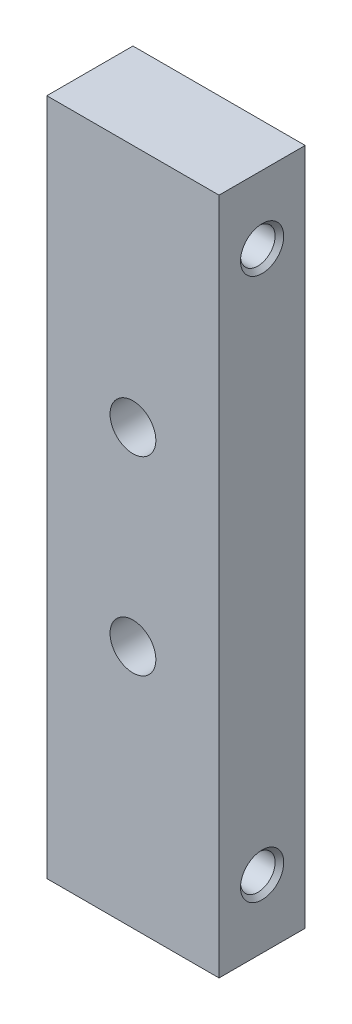
ISO-10303-21;
HEADER;
FILE_DESCRIPTION(('STEP AP214'),'2;1');
FILE_NAME('part.step','',(''),(''),'','','');
FILE_SCHEMA(('AUTOMOTIVE_DESIGN { 1 0 10303 214 1 1 1 1 }'));
ENDSEC;
DATA;
#1=APPLICATION_CONTEXT('core data for automotive mechanical design processes');
#2=APPLICATION_PROTOCOL_DEFINITION('international standard','automotive_design',2000,#1);
#3=PRODUCT_CONTEXT('',#1,'mechanical');
#4=PRODUCT('Part','Part','',(#3));
#5=PRODUCT_RELATED_PRODUCT_CATEGORY('part','',(#4));
#6=PRODUCT_DEFINITION_FORMATION('','',#4);
#7=PRODUCT_DEFINITION_CONTEXT('part definition',#1,'design');
#8=PRODUCT_DEFINITION('design','',#6,#7);
#9=PRODUCT_DEFINITION_SHAPE('','',#8);
#10=(LENGTH_UNIT() NAMED_UNIT(*) SI_UNIT(.MILLI.,.METRE.));
#11=(NAMED_UNIT(*) PLANE_ANGLE_UNIT() SI_UNIT($,.RADIAN.));
#12=(NAMED_UNIT(*) SI_UNIT($,.STERADIAN.) SOLID_ANGLE_UNIT());
#13=UNCERTAINTY_MEASURE_WITH_UNIT(LENGTH_MEASURE(1.E-05),#10,'distance_accuracy_value','');
#14=(GEOMETRIC_REPRESENTATION_CONTEXT(3) GLOBAL_UNCERTAINTY_ASSIGNED_CONTEXT((#13)) GLOBAL_UNIT_ASSIGNED_CONTEXT((#10,
#11,#12)) REPRESENTATION_CONTEXT('',''));
#15=CARTESIAN_POINT('',(0.,0.,0.));
#16=DIRECTION('',(0.,0.,1.));
#17=DIRECTION('',(1.,0.,0.));
#18=AXIS2_PLACEMENT_3D('',#15,#16,#17);
#19=CARTESIAN_POINT('',(-12.7,50.,6.35));
#20=DIRECTION('',(1.,0.,0.));
#21=DIRECTION('',(0.,1.,0.));
#22=AXIS2_PLACEMENT_3D('',#19,#20,#21);
#23=PLANE('',#22);
#24=CARTESIAN_POINT('',(-12.7,40.,0.));
#25=DIRECTION('',(-1.,0.,0.));
#26=DIRECTION('',(0.,0.,1.));
#27=AXIS2_PLACEMENT_3D('',#24,#25,#26);
#28=CIRCLE('',#27,3.1877);
#29=CARTESIAN_POINT('',(-12.7,40.,3.1877));
#30=VERTEX_POINT('',#29);
#31=EDGE_CURVE('E141',#30,#30,#28,.T.);
#32=ORIENTED_EDGE('',*,*,#31,.F.);
#33=EDGE_LOOP('',(#32));
#34=FACE_BOUND('',#33,.T.);
#35=CARTESIAN_POINT('',(-12.7,-40.,0.));
#36=DIRECTION('',(-1.,0.,0.));
#37=DIRECTION('',(0.,0.,1.));
#38=AXIS2_PLACEMENT_3D('',#35,#36,#37);
#39=CIRCLE('',#38,3.1877);
#40=CARTESIAN_POINT('',(-12.7,-40.,3.1877));
#41=VERTEX_POINT('',#40);
#42=EDGE_CURVE('E129',#41,#41,#39,.T.);
#43=ORIENTED_EDGE('',*,*,#42,.F.);
#44=EDGE_LOOP('',(#43));
#45=FACE_BOUND('',#44,.T.);
#46=DIRECTION('',(0.,-1.,0.));
#47=VECTOR('',#46,1.);
#48=CARTESIAN_POINT('',(-12.7,50.,-6.35));
#49=LINE('',#48,#47);
#50=CARTESIAN_POINT('',(-12.7,50.,-6.35));
#51=VERTEX_POINT('',#50);
#52=CARTESIAN_POINT('',(-12.7,-50.,-6.35));
#53=VERTEX_POINT('',#52);
#54=EDGE_CURVE('E98',#51,#53,#49,.T.);
#55=ORIENTED_EDGE('',*,*,#54,.T.);
#56=DIRECTION('',(0.,0.,-1.));
#57=VECTOR('',#56,1.);
#58=CARTESIAN_POINT('',(-12.7,-50.,6.35));
#59=LINE('',#58,#57);
#60=CARTESIAN_POINT('',(-12.7,-50.,6.35));
#61=VERTEX_POINT('',#60);
#62=EDGE_CURVE('E11',#61,#53,#59,.T.);
#63=ORIENTED_EDGE('',*,*,#62,.F.);
#64=DIRECTION('',(0.,-1.,0.));
#65=VECTOR('',#64,1.);
#66=CARTESIAN_POINT('',(-12.7,50.,6.35));
#67=LINE('',#66,#65);
#68=CARTESIAN_POINT('',(-12.7,50.,6.35));
#69=VERTEX_POINT('',#68);
#70=EDGE_CURVE('E86',#69,#61,#67,.T.);
#71=ORIENTED_EDGE('',*,*,#70,.F.);
#72=DIRECTION('',(0.,0.,-1.));
#73=VECTOR('',#72,1.);
#74=CARTESIAN_POINT('',(-12.7,50.,6.35));
#75=LINE('',#74,#73);
#76=EDGE_CURVE('E94',#69,#51,#75,.T.);
#77=ORIENTED_EDGE('',*,*,#76,.T.);
#78=EDGE_LOOP('',(#55,#63,#71,#77));
#79=FACE_BOUND('',#78,.T.);
#80=ADVANCED_FACE('F35',(#34,#45,#79),#23,.F.);
#81=CARTESIAN_POINT('',(-12.7,-50.,6.35));
#82=DIRECTION('',(0.,1.,0.));
#83=DIRECTION('',(0.,0.,1.));
#84=AXIS2_PLACEMENT_3D('',#81,#82,#83);
#85=PLANE('',#84);
#86=DIRECTION('',(1.,0.,0.));
#87=VECTOR('',#86,1.);
#88=CARTESIAN_POINT('',(-12.7,-50.,-6.35));
#89=LINE('',#88,#87);
#90=CARTESIAN_POINT('',(12.7,-50.,-6.35));
#91=VERTEX_POINT('',#90);
#92=EDGE_CURVE('E90',#53,#91,#89,.T.);
#93=ORIENTED_EDGE('',*,*,#92,.T.);
#94=DIRECTION('',(0.,0.,-1.));
#95=VECTOR('',#94,1.);
#96=CARTESIAN_POINT('',(12.7,-50.,6.35));
#97=LINE('',#96,#95);
#98=CARTESIAN_POINT('',(12.7,-50.,6.35));
#99=VERTEX_POINT('',#98);
#100=EDGE_CURVE('E43',#99,#91,#97,.T.);
#101=ORIENTED_EDGE('',*,*,#100,.F.);
#102=DIRECTION('',(1.,0.,0.));
#103=VECTOR('',#102,1.);
#104=CARTESIAN_POINT('',(-12.7,-50.,6.35));
#105=LINE('',#104,#103);
#106=EDGE_CURVE('E81',#61,#99,#105,.T.);
#107=ORIENTED_EDGE('',*,*,#106,.F.);
#108=ORIENTED_EDGE('',*,*,#62,.T.);
#109=EDGE_LOOP('',(#93,#101,#107,#108));
#110=FACE_BOUND('',#109,.T.);
#111=ADVANCED_FACE('F89',(#110),#85,.F.);
#112=CARTESIAN_POINT('',(12.7,50.,6.35));
#113=DIRECTION('',(-1.,0.,0.));
#114=DIRECTION('',(0.,0.,1.));
#115=AXIS2_PLACEMENT_3D('',#112,#113,#114);
#116=PLANE('',#115);
#117=CARTESIAN_POINT('',(12.7,40.,0.));
#118=DIRECTION('',(-1.,0.,0.));
#119=DIRECTION('',(0.,0.,1.));
#120=AXIS2_PLACEMENT_3D('',#117,#118,#119);
#121=CIRCLE('',#120,3.18769999999999);
#122=CARTESIAN_POINT('',(12.7,40.,3.18769999999999));
#123=VERTEX_POINT('',#122);
#124=EDGE_CURVE('E144',#123,#123,#121,.T.);
#125=ORIENTED_EDGE('',*,*,#124,.T.);
#126=EDGE_LOOP('',(#125));
#127=FACE_BOUND('',#126,.T.);
#128=CARTESIAN_POINT('',(12.7,-40.,0.));
#129=DIRECTION('',(-1.,0.,0.));
#130=DIRECTION('',(0.,0.,1.));
#131=AXIS2_PLACEMENT_3D('',#128,#129,#130);
#132=CIRCLE('',#131,3.18769999999999);
#133=CARTESIAN_POINT('',(12.7,-40.,3.18769999999999));
#134=VERTEX_POINT('',#133);
#135=EDGE_CURVE('E132',#134,#134,#132,.T.);
#136=ORIENTED_EDGE('',*,*,#135,.T.);
#137=EDGE_LOOP('',(#136));
#138=FACE_BOUND('',#137,.T.);
#139=DIRECTION('',(0.,1.,0.));
#140=VECTOR('',#139,1.);
#141=CARTESIAN_POINT('',(12.7,50.,-6.35));
#142=LINE('',#141,#140);
#143=CARTESIAN_POINT('',(12.7,50.,-6.35));
#144=VERTEX_POINT('',#143);
#145=EDGE_CURVE('E68',#91,#144,#142,.T.);
#146=ORIENTED_EDGE('',*,*,#145,.T.);
#147=DIRECTION('',(0.,0.,-1.));
#148=VECTOR('',#147,1.);
#149=CARTESIAN_POINT('',(12.7,50.,6.35));
#150=LINE('',#149,#148);
#151=CARTESIAN_POINT('',(12.7,50.,6.35));
#152=VERTEX_POINT('',#151);
#153=EDGE_CURVE('E91',#152,#144,#150,.T.);
#154=ORIENTED_EDGE('',*,*,#153,.F.);
#155=DIRECTION('',(0.,1.,0.));
#156=VECTOR('',#155,1.);
#157=CARTESIAN_POINT('',(12.7,50.,6.35));
#158=LINE('',#157,#156);
#159=EDGE_CURVE('E84',#99,#152,#158,.T.);
#160=ORIENTED_EDGE('',*,*,#159,.F.);
#161=ORIENTED_EDGE('',*,*,#100,.T.);
#162=EDGE_LOOP('',(#146,#154,#160,#161));
#163=FACE_BOUND('',#162,.T.);
#164=ADVANCED_FACE('F92',(#127,#138,#163),#116,.F.);
#165=CARTESIAN_POINT('',(-12.7,50.,6.35));
#166=DIRECTION('',(0.,-1.,0.));
#167=DIRECTION('',(0.,0.,-1.));
#168=AXIS2_PLACEMENT_3D('',#165,#166,#167);
#169=PLANE('',#168);
#170=DIRECTION('',(-1.,0.,0.));
#171=VECTOR('',#170,1.);
#172=CARTESIAN_POINT('',(-12.7,50.,-6.35));
#173=LINE('',#172,#171);
#174=EDGE_CURVE('E74',#144,#51,#173,.T.);
#175=ORIENTED_EDGE('',*,*,#174,.T.);
#176=ORIENTED_EDGE('',*,*,#76,.F.);
#177=DIRECTION('',(-1.,0.,0.));
#178=VECTOR('',#177,1.);
#179=CARTESIAN_POINT('',(-12.7,50.,6.35));
#180=LINE('',#179,#178);
#181=EDGE_CURVE('E51',#152,#69,#180,.T.);
#182=ORIENTED_EDGE('',*,*,#181,.F.);
#183=ORIENTED_EDGE('',*,*,#153,.T.);
#184=EDGE_LOOP('',(#175,#176,#182,#183));
#185=FACE_BOUND('',#184,.T.);
#186=ADVANCED_FACE('F106',(#185),#169,.F.);
#187=CARTESIAN_POINT('',(0.,0.,6.35));
#188=DIRECTION('',(0.,0.,1.));
#189=DIRECTION('',(1.,0.,0.));
#190=AXIS2_PLACEMENT_3D('',#187,#188,#189);
#191=PLANE('',#190);
#192=CARTESIAN_POINT('',(0.,-14.,6.35));
#193=DIRECTION('',(0.,0.,1.));
#194=DIRECTION('',(1.,0.,0.));
#195=AXIS2_PLACEMENT_3D('',#192,#193,#194);
#196=CIRCLE('',#195,3.3782);
#197=CARTESIAN_POINT('',(3.3782,-14.,6.35));
#198=VERTEX_POINT('',#197);
#199=EDGE_CURVE('E120',#198,#198,#196,.T.);
#200=ORIENTED_EDGE('',*,*,#199,.F.);
#201=EDGE_LOOP('',(#200));
#202=FACE_BOUND('',#201,.T.);
#203=CARTESIAN_POINT('',(0.,14.,6.35));
#204=DIRECTION('',(0.,0.,1.));
#205=DIRECTION('',(1.,0.,0.));
#206=AXIS2_PLACEMENT_3D('',#203,#204,#205);
#207=CIRCLE('',#206,3.3782);
#208=CARTESIAN_POINT('',(3.3782,14.,6.35));
#209=VERTEX_POINT('',#208);
#210=EDGE_CURVE('E114',#209,#209,#207,.T.);
#211=ORIENTED_EDGE('',*,*,#210,.F.);
#212=EDGE_LOOP('',(#211));
#213=FACE_BOUND('',#212,.T.);
#214=ORIENTED_EDGE('',*,*,#70,.T.);
#215=ORIENTED_EDGE('',*,*,#106,.T.);
#216=ORIENTED_EDGE('',*,*,#159,.T.);
#217=ORIENTED_EDGE('',*,*,#181,.T.);
#218=EDGE_LOOP('',(#214,#215,#216,#217));
#219=FACE_BOUND('',#218,.T.);
#220=ADVANCED_FACE('F82',(#202,#213,#219),#191,.T.);
#221=CARTESIAN_POINT('',(0.,0.,-6.35));
#222=DIRECTION('',(0.,0.,1.));
#223=DIRECTION('',(1.,0.,0.));
#224=AXIS2_PLACEMENT_3D('',#221,#222,#223);
#225=PLANE('',#224);
#226=CARTESIAN_POINT('',(0.,-14.,-6.35));
#227=DIRECTION('',(0.,0.,1.));
#228=DIRECTION('',(1.,0.,0.));
#229=AXIS2_PLACEMENT_3D('',#226,#227,#228);
#230=CIRCLE('',#229,3.3782);
#231=CARTESIAN_POINT('',(3.3782,-14.,-6.35));
#232=VERTEX_POINT('',#231);
#233=EDGE_CURVE('E117',#232,#232,#230,.T.);
#234=ORIENTED_EDGE('',*,*,#233,.T.);
#235=EDGE_LOOP('',(#234));
#236=FACE_BOUND('',#235,.T.);
#237=CARTESIAN_POINT('',(0.,14.,-6.35));
#238=DIRECTION('',(0.,0.,1.));
#239=DIRECTION('',(1.,0.,0.));
#240=AXIS2_PLACEMENT_3D('',#237,#238,#239);
#241=CIRCLE('',#240,3.3782);
#242=CARTESIAN_POINT('',(3.3782,14.,-6.35));
#243=VERTEX_POINT('',#242);
#244=EDGE_CURVE('E101',#243,#243,#241,.T.);
#245=ORIENTED_EDGE('',*,*,#244,.T.);
#246=EDGE_LOOP('',(#245));
#247=FACE_BOUND('',#246,.T.);
#248=ORIENTED_EDGE('',*,*,#54,.F.);
#249=ORIENTED_EDGE('',*,*,#174,.F.);
#250=ORIENTED_EDGE('',*,*,#145,.F.);
#251=ORIENTED_EDGE('',*,*,#92,.F.);
#252=EDGE_LOOP('',(#248,#249,#250,#251));
#253=FACE_BOUND('',#252,.T.);
#254=ADVANCED_FACE('F109',(#236,#247,#253),#225,.F.);
#255=CARTESIAN_POINT('',(0.,14.,6.35));
#256=DIRECTION('',(0.,0.,1.));
#257=DIRECTION('',(1.,0.,0.));
#258=AXIS2_PLACEMENT_3D('',#255,#256,#257);
#259=CYLINDRICAL_SURFACE('',#258,3.3782);
#260=ORIENTED_EDGE('',*,*,#244,.F.);
#261=EDGE_LOOP('',(#260));
#262=FACE_BOUND('',#261,.T.);
#263=ORIENTED_EDGE('',*,*,#210,.T.);
#264=EDGE_LOOP('',(#263));
#265=FACE_BOUND('',#264,.T.);
#266=ADVANCED_FACE('F191',(#262,#265),#259,.F.);
#267=CARTESIAN_POINT('',(0.,-14.,6.35));
#268=DIRECTION('',(0.,0.,1.));
#269=DIRECTION('',(1.,0.,0.));
#270=AXIS2_PLACEMENT_3D('',#267,#268,#269);
#271=CYLINDRICAL_SURFACE('',#270,3.3782);
#272=ORIENTED_EDGE('',*,*,#233,.F.);
#273=EDGE_LOOP('',(#272));
#274=FACE_BOUND('',#273,.T.);
#275=ORIENTED_EDGE('',*,*,#199,.T.);
#276=EDGE_LOOP('',(#275));
#277=FACE_BOUND('',#276,.T.);
#278=ADVANCED_FACE('F187',(#274,#277),#271,.F.);
#279=CARTESIAN_POINT('',(12.065,-40.,0.));
#280=DIRECTION('',(1.,0.,0.));
#281=DIRECTION('',(0.,0.,-1.));
#282=AXIS2_PLACEMENT_3D('',#279,#280,#281);
#283=CONICAL_SURFACE('',#282,2.55269999999998,0.785398163397459);
#284=ORIENTED_EDGE('',*,*,#135,.F.);
#285=EDGE_LOOP('',(#284));
#286=FACE_BOUND('',#285,.T.);
#287=CARTESIAN_POINT('',(12.065,-40.,0.));
#288=DIRECTION('',(-1.,0.,0.));
#289=DIRECTION('',(0.,0.,1.));
#290=AXIS2_PLACEMENT_3D('',#287,#288,#289);
#291=CIRCLE('',#290,2.55269999999998);
#292=CARTESIAN_POINT('',(12.065,-40.,2.55269999999998));
#293=VERTEX_POINT('',#292);
#294=EDGE_CURVE('E123',#293,#293,#291,.T.);
#295=ORIENTED_EDGE('',*,*,#294,.T.);
#296=EDGE_LOOP('',(#295));
#297=FACE_BOUND('',#296,.T.);
#298=ADVANCED_FACE('F180',(#286,#297),#283,.F.);
#299=CARTESIAN_POINT('',(-12.7,-40.,0.));
#300=DIRECTION('',(-1.,0.,0.));
#301=DIRECTION('',(0.,0.,1.));
#302=AXIS2_PLACEMENT_3D('',#299,#300,#301);
#303=CYLINDRICAL_SURFACE('',#302,2.55269999999998);
#304=ORIENTED_EDGE('',*,*,#294,.F.);
#305=EDGE_LOOP('',(#304));
#306=FACE_BOUND('',#305,.T.);
#307=CARTESIAN_POINT('',(-12.065,-40.,0.));
#308=DIRECTION('',(-1.,0.,0.));
#309=DIRECTION('',(0.,0.,1.));
#310=AXIS2_PLACEMENT_3D('',#307,#308,#309);
#311=CIRCLE('',#310,2.55269999999998);
#312=CARTESIAN_POINT('',(-12.065,-40.,2.55269999999998));
#313=VERTEX_POINT('',#312);
#314=EDGE_CURVE('E126',#313,#313,#311,.T.);
#315=ORIENTED_EDGE('',*,*,#314,.T.);
#316=EDGE_LOOP('',(#315));
#317=FACE_BOUND('',#316,.T.);
#318=ADVANCED_FACE('F174',(#306,#317),#303,.F.);
#319=CARTESIAN_POINT('',(-12.7,-40.,0.));
#320=DIRECTION('',(-1.,0.,0.));
#321=DIRECTION('',(0.,0.,1.));
#322=AXIS2_PLACEMENT_3D('',#319,#320,#321);
#323=CONICAL_SURFACE('',#322,3.1877,0.785398163397452);
#324=ORIENTED_EDGE('',*,*,#314,.F.);
#325=EDGE_LOOP('',(#324));
#326=FACE_BOUND('',#325,.T.);
#327=ORIENTED_EDGE('',*,*,#42,.T.);
#328=EDGE_LOOP('',(#327));
#329=FACE_BOUND('',#328,.T.);
#330=ADVANCED_FACE('F154',(#326,#329),#323,.F.);
#331=CARTESIAN_POINT('',(12.065,40.,0.));
#332=DIRECTION('',(1.,0.,0.));
#333=DIRECTION('',(0.,0.,-1.));
#334=AXIS2_PLACEMENT_3D('',#331,#332,#333);
#335=CONICAL_SURFACE('',#334,2.55269999999998,0.785398163397459);
#336=ORIENTED_EDGE('',*,*,#124,.F.);
#337=EDGE_LOOP('',(#336));
#338=FACE_BOUND('',#337,.T.);
#339=CARTESIAN_POINT('',(12.065,40.,0.));
#340=DIRECTION('',(-1.,0.,0.));
#341=DIRECTION('',(0.,0.,1.));
#342=AXIS2_PLACEMENT_3D('',#339,#340,#341);
#343=CIRCLE('',#342,2.55269999999998);
#344=CARTESIAN_POINT('',(12.065,40.,2.55269999999998));
#345=VERTEX_POINT('',#344);
#346=EDGE_CURVE('E135',#345,#345,#343,.T.);
#347=ORIENTED_EDGE('',*,*,#346,.T.);
#348=EDGE_LOOP('',(#347));
#349=FACE_BOUND('',#348,.T.);
#350=ADVANCED_FACE('F150',(#338,#349),#335,.F.);
#351=CARTESIAN_POINT('',(-12.7,40.,0.));
#352=DIRECTION('',(-1.,0.,0.));
#353=DIRECTION('',(0.,0.,1.));
#354=AXIS2_PLACEMENT_3D('',#351,#352,#353);
#355=CYLINDRICAL_SURFACE('',#354,2.55269999999998);
#356=ORIENTED_EDGE('',*,*,#346,.F.);
#357=EDGE_LOOP('',(#356));
#358=FACE_BOUND('',#357,.T.);
#359=CARTESIAN_POINT('',(-12.065,40.,0.));
#360=DIRECTION('',(-1.,0.,0.));
#361=DIRECTION('',(0.,0.,1.));
#362=AXIS2_PLACEMENT_3D('',#359,#360,#361);
#363=CIRCLE('',#362,2.55269999999998);
#364=CARTESIAN_POINT('',(-12.065,40.,2.55269999999998));
#365=VERTEX_POINT('',#364);
#366=EDGE_CURVE('E138',#365,#365,#363,.T.);
#367=ORIENTED_EDGE('',*,*,#366,.T.);
#368=EDGE_LOOP('',(#367));
#369=FACE_BOUND('',#368,.T.);
#370=ADVANCED_FACE('F153',(#358,#369),#355,.F.);
#371=CARTESIAN_POINT('',(-12.7,40.,0.));
#372=DIRECTION('',(-1.,0.,0.));
#373=DIRECTION('',(0.,0.,1.));
#374=AXIS2_PLACEMENT_3D('',#371,#372,#373);
#375=CONICAL_SURFACE('',#374,3.1877,0.785398163397452);
#376=ORIENTED_EDGE('',*,*,#366,.F.);
#377=EDGE_LOOP('',(#376));
#378=FACE_BOUND('',#377,.T.);
#379=ORIENTED_EDGE('',*,*,#31,.T.);
#380=EDGE_LOOP('',(#379));
#381=FACE_BOUND('',#380,.T.);
#382=ADVANCED_FACE('F160',(#378,#381),#375,.F.);
#383=CLOSED_SHELL('',(#80,#111,#164,#186,#220,#254,#266,#278,#298,#318,#330,#350,#370,#382));
#384=MANIFOLD_SOLID_BREP('B2',#383);
#385=ADVANCED_BREP_SHAPE_REPRESENTATION('',(#18,#384),#14);
#386=SHAPE_DEFINITION_REPRESENTATION(#9,#385);
ENDSEC;
END-ISO-10303-21;
